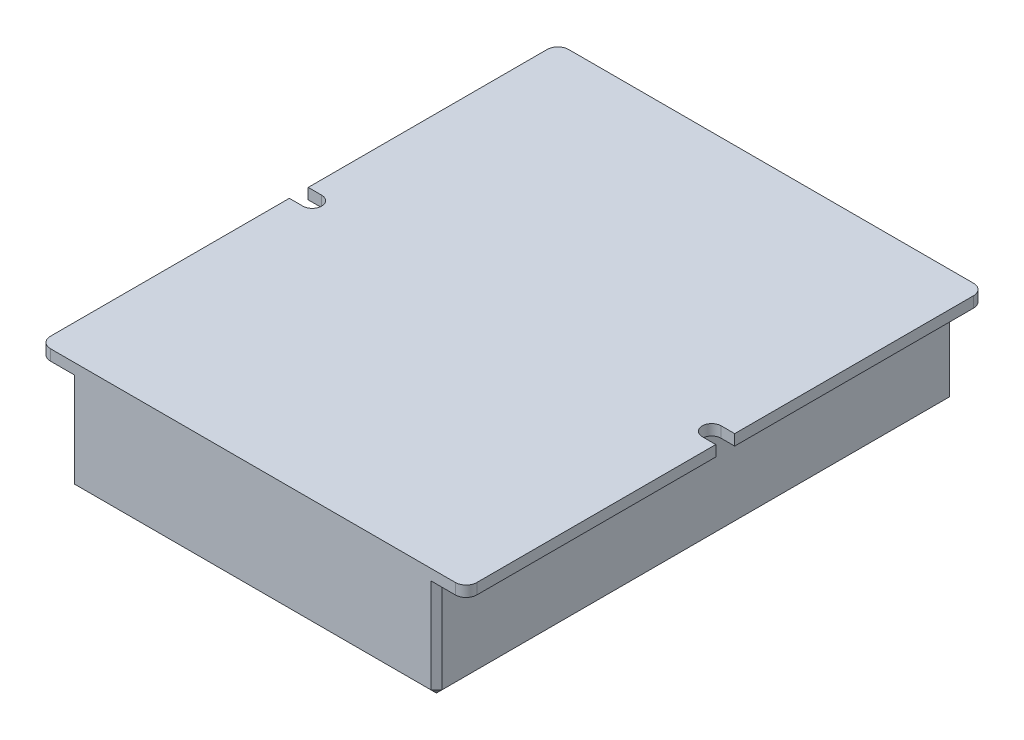
ISO-10303-21;
HEADER;
FILE_DESCRIPTION(('STEP AP214'),'2;1');
FILE_NAME('part.step','',(''),(''),'','','');
FILE_SCHEMA(('AUTOMOTIVE_DESIGN { 1 0 10303 214 1 1 1 1 }'));
ENDSEC;
DATA;
#1=APPLICATION_CONTEXT('core data for automotive mechanical design processes');
#2=APPLICATION_PROTOCOL_DEFINITION('international standard','automotive_design',2000,#1);
#3=PRODUCT_CONTEXT('',#1,'mechanical');
#4=PRODUCT('Part','Part','',(#3));
#5=PRODUCT_RELATED_PRODUCT_CATEGORY('part','',(#4));
#6=PRODUCT_DEFINITION_FORMATION('','',#4);
#7=PRODUCT_DEFINITION_CONTEXT('part definition',#1,'design');
#8=PRODUCT_DEFINITION('design','',#6,#7);
#9=PRODUCT_DEFINITION_SHAPE('','',#8);
#10=(LENGTH_UNIT() NAMED_UNIT(*) SI_UNIT(.MILLI.,.METRE.));
#11=(NAMED_UNIT(*) PLANE_ANGLE_UNIT() SI_UNIT($,.RADIAN.));
#12=(NAMED_UNIT(*) SI_UNIT($,.STERADIAN.) SOLID_ANGLE_UNIT());
#13=UNCERTAINTY_MEASURE_WITH_UNIT(LENGTH_MEASURE(1.E-05),#10,'distance_accuracy_value','');
#14=(GEOMETRIC_REPRESENTATION_CONTEXT(3) GLOBAL_UNCERTAINTY_ASSIGNED_CONTEXT((#13)) GLOBAL_UNIT_ASSIGNED_CONTEXT((#10,
#11,#12)) REPRESENTATION_CONTEXT('',''));
#15=CARTESIAN_POINT('',(0.,0.,0.));
#16=DIRECTION('',(0.,0.,1.));
#17=DIRECTION('',(1.,0.,0.));
#18=AXIS2_PLACEMENT_3D('',#15,#16,#17);
#19=CARTESIAN_POINT('',(-39.5,0.,48.));
#20=DIRECTION('',(-1.,0.,0.));
#21=DIRECTION('',(0.,0.,1.));
#22=AXIS2_PLACEMENT_3D('',#19,#20,#21);
#23=PLANE('',#22);
#24=DIRECTION('',(0.,0.,-1.));
#25=VECTOR('',#24,1.);
#26=CARTESIAN_POINT('',(-39.5,0.,48.));
#27=LINE('',#26,#25);
#28=CARTESIAN_POINT('',(-39.5,0.,46.));
#29=VERTEX_POINT('',#28);
#30=CARTESIAN_POINT('',(-39.5,0.,1.75));
#31=VERTEX_POINT('',#30);
#32=EDGE_CURVE('E237',#29,#31,#27,.T.);
#33=ORIENTED_EDGE('',*,*,#32,.T.);
#34=DIRECTION('',(0.,-1.,0.));
#35=VECTOR('',#34,1.);
#36=CARTESIAN_POINT('',(-39.5,10.3090938927864,1.75));
#37=LINE('',#36,#35);
#38=CARTESIAN_POINT('',(-39.5,-2.,1.75));
#39=VERTEX_POINT('',#38);
#40=EDGE_CURVE('E33',#31,#39,#37,.T.);
#41=ORIENTED_EDGE('',*,*,#40,.T.);
#42=DIRECTION('',(0.,0.,-1.));
#43=VECTOR('',#42,1.);
#44=CARTESIAN_POINT('',(-39.5,-2.,48.));
#45=LINE('',#44,#43);
#46=CARTESIAN_POINT('',(-39.5,-2.,46.));
#47=VERTEX_POINT('',#46);
#48=EDGE_CURVE('E207',#47,#39,#45,.T.);
#49=ORIENTED_EDGE('',*,*,#48,.F.);
#50=DIRECTION('',(0.,-1.,0.));
#51=VECTOR('',#50,1.);
#52=CARTESIAN_POINT('',(-39.5,0.,46.));
#53=LINE('',#52,#51);
#54=EDGE_CURVE('E345',#47,#29,#53,.F.);
#55=ORIENTED_EDGE('',*,*,#54,.T.);
#56=EDGE_LOOP('',(#33,#41,#49,#55));
#57=FACE_BOUND('',#56,.T.);
#58=ADVANCED_FACE('F18',(#57),#23,.T.);
#59=CARTESIAN_POINT('',(-37.,6.52027712167723,0.));
#60=DIRECTION('',(0.,-1.,0.));
#61=DIRECTION('',(0.,0.,-1.));
#62=AXIS2_PLACEMENT_3D('',#59,#60,#61);
#63=CYLINDRICAL_SURFACE('',#62,1.75);
#64=CARTESIAN_POINT('',(-37.,0.,0.));
#65=DIRECTION('',(0.,1.,0.));
#66=DIRECTION('',(0.,0.,1.));
#67=AXIS2_PLACEMENT_3D('',#64,#65,#66);
#68=CIRCLE('',#67,1.75);
#69=CARTESIAN_POINT('',(-37.,0.,-1.75));
#70=VERTEX_POINT('',#69);
#71=CARTESIAN_POINT('',(-37.,0.,1.75));
#72=VERTEX_POINT('',#71);
#73=EDGE_CURVE('E213',#70,#72,#68,.F.);
#74=ORIENTED_EDGE('',*,*,#73,.F.);
#75=DIRECTION('',(0.,-1.,0.));
#76=VECTOR('',#75,1.);
#77=CARTESIAN_POINT('',(-37.,10.3090938927864,-1.75));
#78=LINE('',#77,#76);
#79=CARTESIAN_POINT('',(-37.,-2.,-1.75));
#80=VERTEX_POINT('',#79);
#81=EDGE_CURVE('E41',#70,#80,#78,.T.);
#82=ORIENTED_EDGE('',*,*,#81,.T.);
#83=CARTESIAN_POINT('',(-37.,-2.,0.));
#84=DIRECTION('',(0.,1.,0.));
#85=DIRECTION('',(1.,0.,0.));
#86=AXIS2_PLACEMENT_3D('',#83,#84,#85);
#87=CIRCLE('',#86,1.75);
#88=CARTESIAN_POINT('',(-37.,-2.,1.75));
#89=VERTEX_POINT('',#88);
#90=EDGE_CURVE('E205',#89,#80,#87,.T.);
#91=ORIENTED_EDGE('',*,*,#90,.F.);
#92=DIRECTION('',(0.,-1.,0.));
#93=VECTOR('',#92,1.);
#94=CARTESIAN_POINT('',(-37.,10.3090938927864,1.75));
#95=LINE('',#94,#93);
#96=EDGE_CURVE('E189',#72,#89,#95,.T.);
#97=ORIENTED_EDGE('',*,*,#96,.F.);
#98=EDGE_LOOP('',(#74,#82,#91,#97));
#99=FACE_BOUND('',#98,.T.);
#100=ADVANCED_FACE('F211',(#99),#63,.F.);
#101=CARTESIAN_POINT('',(39.5,0.,-48.));
#102=DIRECTION('',(1.,0.,0.));
#103=DIRECTION('',(0.,0.,-1.));
#104=AXIS2_PLACEMENT_3D('',#101,#102,#103);
#105=PLANE('',#104);
#106=DIRECTION('',(0.,0.,1.));
#107=VECTOR('',#106,1.);
#108=CARTESIAN_POINT('',(39.5,0.,-48.));
#109=LINE('',#108,#107);
#110=CARTESIAN_POINT('',(39.5,0.,-46.));
#111=VERTEX_POINT('',#110);
#112=CARTESIAN_POINT('',(39.5,0.,-1.75));
#113=VERTEX_POINT('',#112);
#114=EDGE_CURVE('E228',#111,#113,#109,.T.);
#115=ORIENTED_EDGE('',*,*,#114,.T.);
#116=DIRECTION('',(0.,-1.,0.));
#117=VECTOR('',#116,1.);
#118=CARTESIAN_POINT('',(39.5,10.885688738745,-1.75));
#119=LINE('',#118,#117);
#120=CARTESIAN_POINT('',(39.5,-2.,-1.75));
#121=VERTEX_POINT('',#120);
#122=EDGE_CURVE('E409',#113,#121,#119,.T.);
#123=ORIENTED_EDGE('',*,*,#122,.T.);
#124=DIRECTION('',(0.,0.,1.));
#125=VECTOR('',#124,1.);
#126=CARTESIAN_POINT('',(39.5,-2.,-48.));
#127=LINE('',#126,#125);
#128=CARTESIAN_POINT('',(39.5,-2.,-46.));
#129=VERTEX_POINT('',#128);
#130=EDGE_CURVE('E233',#129,#121,#127,.T.);
#131=ORIENTED_EDGE('',*,*,#130,.F.);
#132=DIRECTION('',(0.,-1.,0.));
#133=VECTOR('',#132,1.);
#134=CARTESIAN_POINT('',(39.5,0.,-46.));
#135=LINE('',#134,#133);
#136=EDGE_CURVE('E365',#129,#111,#135,.F.);
#137=ORIENTED_EDGE('',*,*,#136,.T.);
#138=EDGE_LOOP('',(#115,#123,#131,#137));
#139=FACE_BOUND('',#138,.T.);
#140=ADVANCED_FACE('F463',(#139),#105,.T.);
#141=CARTESIAN_POINT('',(37.,6.52027712167723,0.));
#142=DIRECTION('',(0.,-1.,0.));
#143=DIRECTION('',(0.,0.,-1.));
#144=AXIS2_PLACEMENT_3D('',#141,#142,#143);
#145=CYLINDRICAL_SURFACE('',#144,1.75);
#146=CARTESIAN_POINT('',(37.,0.,0.));
#147=DIRECTION('',(0.,1.,0.));
#148=DIRECTION('',(0.,0.,1.));
#149=AXIS2_PLACEMENT_3D('',#146,#147,#148);
#150=CIRCLE('',#149,1.75);
#151=CARTESIAN_POINT('',(37.,0.,1.75));
#152=VERTEX_POINT('',#151);
#153=CARTESIAN_POINT('',(37.,0.,-1.75));
#154=VERTEX_POINT('',#153);
#155=EDGE_CURVE('E214',#152,#154,#150,.F.);
#156=ORIENTED_EDGE('',*,*,#155,.F.);
#157=DIRECTION('',(0.,-1.,0.));
#158=VECTOR('',#157,1.);
#159=CARTESIAN_POINT('',(37.,10.885688738745,1.75));
#160=LINE('',#159,#158);
#161=CARTESIAN_POINT('',(37.,-2.,1.75));
#162=VERTEX_POINT('',#161);
#163=EDGE_CURVE('E405',#152,#162,#160,.T.);
#164=ORIENTED_EDGE('',*,*,#163,.T.);
#165=CARTESIAN_POINT('',(37.,-2.,0.));
#166=DIRECTION('',(0.,1.,0.));
#167=DIRECTION('',(1.,0.,0.));
#168=AXIS2_PLACEMENT_3D('',#165,#166,#167);
#169=CIRCLE('',#168,1.75);
#170=CARTESIAN_POINT('',(37.,-2.,-1.75));
#171=VERTEX_POINT('',#170);
#172=EDGE_CURVE('E223',#171,#162,#169,.T.);
#173=ORIENTED_EDGE('',*,*,#172,.F.);
#174=DIRECTION('',(0.,-1.,0.));
#175=VECTOR('',#174,1.);
#176=CARTESIAN_POINT('',(37.,10.885688738745,-1.75));
#177=LINE('',#176,#175);
#178=EDGE_CURVE('E398',#154,#171,#177,.T.);
#179=ORIENTED_EDGE('',*,*,#178,.F.);
#180=EDGE_LOOP('',(#156,#164,#173,#179));
#181=FACE_BOUND('',#180,.T.);
#182=ADVANCED_FACE('F403',(#181),#145,.F.);
#183=CARTESIAN_POINT('',(0.,-2.,0.));
#184=DIRECTION('',(0.,1.,0.));
#185=DIRECTION('',(0.,0.,1.));
#186=AXIS2_PLACEMENT_3D('',#183,#184,#185);
#187=PLANE('',#186);
#188=DIRECTION('',(1.,0.,0.));
#189=VECTOR('',#188,1.);
#190=CARTESIAN_POINT('',(37.,-2.,-1.75));
#191=LINE('',#190,#189);
#192=EDGE_CURVE('E433',#171,#121,#191,.T.);
#193=ORIENTED_EDGE('',*,*,#192,.F.);
#194=ORIENTED_EDGE('',*,*,#172,.T.);
#195=DIRECTION('',(-1.,0.,0.));
#196=VECTOR('',#195,1.);
#197=CARTESIAN_POINT('',(37.,-2.,1.75));
#198=LINE('',#197,#196);
#199=CARTESIAN_POINT('',(39.5,-2.,1.75));
#200=VERTEX_POINT('',#199);
#201=EDGE_CURVE('E432',#200,#162,#198,.T.);
#202=ORIENTED_EDGE('',*,*,#201,.F.);
#203=CARTESIAN_POINT('',(39.5,-2.,46.));
#204=VERTEX_POINT('',#203);
#205=EDGE_CURVE('E220',#200,#204,#127,.T.);
#206=ORIENTED_EDGE('',*,*,#205,.T.);
#207=CARTESIAN_POINT('',(37.5,-2.,46.));
#208=DIRECTION('',(0.,1.,0.));
#209=DIRECTION('',(0.,0.,1.));
#210=AXIS2_PLACEMENT_3D('',#207,#208,#209);
#211=CIRCLE('',#210,2.);
#212=CARTESIAN_POINT('',(37.5,-2.,48.));
#213=VERTEX_POINT('',#212);
#214=EDGE_CURVE('E372',#204,#213,#211,.F.);
#215=ORIENTED_EDGE('',*,*,#214,.T.);
#216=DIRECTION('',(1.,0.,0.));
#217=VECTOR('',#216,1.);
#218=CARTESIAN_POINT('',(-37.,-2.,48.));
#219=LINE('',#218,#217);
#220=CARTESIAN_POINT('',(33.,-2.,48.));
#221=VERTEX_POINT('',#220);
#222=EDGE_CURVE('E252',#221,#213,#219,.T.);
#223=ORIENTED_EDGE('',*,*,#222,.F.);
#224=DIRECTION('',(0.707106781186545,0.,-0.70710678118655));
#225=VECTOR('',#224,1.);
#226=CARTESIAN_POINT('',(40.5,-2.,40.5));
#227=LINE('',#226,#225);
#228=CARTESIAN_POINT('',(34.,-2.,47.));
#229=VERTEX_POINT('',#228);
#230=EDGE_CURVE('E297',#221,#229,#227,.T.);
#231=ORIENTED_EDGE('',*,*,#230,.T.);
#232=DIRECTION('',(0.,0.,1.));
#233=VECTOR('',#232,1.);
#234=CARTESIAN_POINT('',(34.,-2.,0.));
#235=LINE('',#234,#233);
#236=CARTESIAN_POINT('',(34.,-2.,-47.));
#237=VERTEX_POINT('',#236);
#238=EDGE_CURVE('E340',#237,#229,#235,.T.);
#239=ORIENTED_EDGE('',*,*,#238,.F.);
#240=DIRECTION('',(-0.707106781186548,0.,-0.707106781186548));
#241=VECTOR('',#240,1.);
#242=CARTESIAN_POINT('',(40.5,-2.,-40.5));
#243=LINE('',#242,#241);
#244=CARTESIAN_POINT('',(33.,-2.,-48.));
#245=VERTEX_POINT('',#244);
#246=EDGE_CURVE('E299',#237,#245,#243,.T.);
#247=ORIENTED_EDGE('',*,*,#246,.T.);
#248=DIRECTION('',(-1.,0.,0.));
#249=VECTOR('',#248,1.);
#250=CARTESIAN_POINT('',(37.,-2.,-48.));
#251=LINE('',#250,#249);
#252=CARTESIAN_POINT('',(37.5,-2.,-48.));
#253=VERTEX_POINT('',#252);
#254=EDGE_CURVE('E244',#253,#245,#251,.T.);
#255=ORIENTED_EDGE('',*,*,#254,.F.);
#256=CARTESIAN_POINT('',(37.5,-2.,-46.));
#257=DIRECTION('',(0.,1.,0.));
#258=DIRECTION('',(0.,0.,1.));
#259=AXIS2_PLACEMENT_3D('',#256,#257,#258);
#260=CIRCLE('',#259,2.);
#261=EDGE_CURVE('E363',#253,#129,#260,.F.);
#262=ORIENTED_EDGE('',*,*,#261,.T.);
#263=ORIENTED_EDGE('',*,*,#130,.T.);
#264=EDGE_LOOP('',(#193,#194,#202,#206,#215,#223,#231,#239,#247,#255,#262,#263));
#265=FACE_BOUND('',#264,.T.);
#266=ADVANCED_FACE('F431',(#265),#187,.F.);
#267=DIRECTION('',(-1.,0.,0.));
#268=VECTOR('',#267,1.);
#269=CARTESIAN_POINT('',(-37.,-2.,1.75));
#270=LINE('',#269,#268);
#271=EDGE_CURVE('E192',#89,#39,#270,.T.);
#272=ORIENTED_EDGE('',*,*,#271,.F.);
#273=ORIENTED_EDGE('',*,*,#90,.T.);
#274=DIRECTION('',(1.,0.,0.));
#275=VECTOR('',#274,1.);
#276=CARTESIAN_POINT('',(-37.,-2.,-1.75));
#277=LINE('',#276,#275);
#278=CARTESIAN_POINT('',(-39.5,-2.,-1.75));
#279=VERTEX_POINT('',#278);
#280=EDGE_CURVE('E209',#279,#80,#277,.T.);
#281=ORIENTED_EDGE('',*,*,#280,.F.);
#282=CARTESIAN_POINT('',(-39.5,-2.,-46.));
#283=VERTEX_POINT('',#282);
#284=EDGE_CURVE('E231',#279,#283,#45,.T.);
#285=ORIENTED_EDGE('',*,*,#284,.T.);
#286=CARTESIAN_POINT('',(-37.5,-2.,-46.));
#287=DIRECTION('',(0.,1.,0.));
#288=DIRECTION('',(0.,0.,1.));
#289=AXIS2_PLACEMENT_3D('',#286,#287,#288);
#290=CIRCLE('',#289,2.);
#291=CARTESIAN_POINT('',(-37.5,-2.,-48.));
#292=VERTEX_POINT('',#291);
#293=EDGE_CURVE('E352',#283,#292,#290,.F.);
#294=ORIENTED_EDGE('',*,*,#293,.T.);
#295=CARTESIAN_POINT('',(-33.,-2.,-48.));
#296=VERTEX_POINT('',#295);
#297=EDGE_CURVE('E248',#296,#292,#251,.T.);
#298=ORIENTED_EDGE('',*,*,#297,.F.);
#299=DIRECTION('',(-0.707106781186545,0.,0.70710678118655));
#300=VECTOR('',#299,1.);
#301=CARTESIAN_POINT('',(-40.5,-2.,-40.5));
#302=LINE('',#301,#300);
#303=CARTESIAN_POINT('',(-34.,-2.,-47.));
#304=VERTEX_POINT('',#303);
#305=EDGE_CURVE('E302',#296,#304,#302,.T.);
#306=ORIENTED_EDGE('',*,*,#305,.T.);
#307=DIRECTION('',(0.,0.,-1.));
#308=VECTOR('',#307,1.);
#309=CARTESIAN_POINT('',(-34.,-2.,0.));
#310=LINE('',#309,#308);
#311=CARTESIAN_POINT('',(-34.,-2.,47.));
#312=VERTEX_POINT('',#311);
#313=EDGE_CURVE('E418',#312,#304,#310,.T.);
#314=ORIENTED_EDGE('',*,*,#313,.F.);
#315=DIRECTION('',(0.707106781186548,0.,0.707106781186548));
#316=VECTOR('',#315,1.);
#317=CARTESIAN_POINT('',(-40.5,-2.,40.5));
#318=LINE('',#317,#316);
#319=CARTESIAN_POINT('',(-33.,-2.,48.));
#320=VERTEX_POINT('',#319);
#321=EDGE_CURVE('E294',#312,#320,#318,.T.);
#322=ORIENTED_EDGE('',*,*,#321,.T.);
#323=CARTESIAN_POINT('',(-37.5,-2.,48.));
#324=VERTEX_POINT('',#323);
#325=EDGE_CURVE('E249',#324,#320,#219,.T.);
#326=ORIENTED_EDGE('',*,*,#325,.F.);
#327=CARTESIAN_POINT('',(-37.5,-2.,46.));
#328=DIRECTION('',(0.,1.,0.));
#329=DIRECTION('',(0.,0.,1.));
#330=AXIS2_PLACEMENT_3D('',#327,#328,#329);
#331=CIRCLE('',#330,2.);
#332=EDGE_CURVE('E343',#324,#47,#331,.F.);
#333=ORIENTED_EDGE('',*,*,#332,.T.);
#334=ORIENTED_EDGE('',*,*,#48,.T.);
#335=EDGE_LOOP('',(#272,#273,#281,#285,#294,#298,#306,#314,#322,#326,#333,#334));
#336=FACE_BOUND('',#335,.T.);
#337=ADVANCED_FACE('F203',(#336),#187,.F.);
#338=CARTESIAN_POINT('',(-37.,-2.,48.));
#339=DIRECTION('',(0.,0.,1.));
#340=DIRECTION('',(1.,0.,0.));
#341=AXIS2_PLACEMENT_3D('',#338,#339,#340);
#342=PLANE('',#341);
#343=ORIENTED_EDGE('',*,*,#222,.T.);
#344=DIRECTION('',(0.,-1.,0.));
#345=VECTOR('',#344,1.);
#346=CARTESIAN_POINT('',(37.5,-2.,48.));
#347=LINE('',#346,#345);
#348=CARTESIAN_POINT('',(37.5,0.,48.));
#349=VERTEX_POINT('',#348);
#350=EDGE_CURVE('E26',#213,#349,#347,.F.);
#351=ORIENTED_EDGE('',*,*,#350,.T.);
#352=DIRECTION('',(1.,0.,0.));
#353=VECTOR('',#352,1.);
#354=CARTESIAN_POINT('',(-37.,0.,48.));
#355=LINE('',#354,#353);
#356=CARTESIAN_POINT('',(-37.5,0.,48.));
#357=VERTEX_POINT('',#356);
#358=EDGE_CURVE('E240',#357,#349,#355,.T.);
#359=ORIENTED_EDGE('',*,*,#358,.F.);
#360=DIRECTION('',(0.,-1.,0.));
#361=VECTOR('',#360,1.);
#362=CARTESIAN_POINT('',(-37.5,-2.,48.));
#363=LINE('',#362,#361);
#364=EDGE_CURVE('E304',#357,#324,#363,.T.);
#365=ORIENTED_EDGE('',*,*,#364,.T.);
#366=ORIENTED_EDGE('',*,*,#325,.T.);
#367=DIRECTION('',(0.,-1.,0.));
#368=VECTOR('',#367,1.);
#369=CARTESIAN_POINT('',(-33.,-20.5,48.));
#370=LINE('',#369,#368);
#371=CARTESIAN_POINT('',(-33.,-19.5,48.));
#372=VERTEX_POINT('',#371);
#373=EDGE_CURVE('E279',#320,#372,#370,.T.);
#374=ORIENTED_EDGE('',*,*,#373,.T.);
#375=DIRECTION('',(1.,0.,0.));
#376=VECTOR('',#375,1.);
#377=CARTESIAN_POINT('',(-37.,-19.5,48.));
#378=LINE('',#377,#376);
#379=CARTESIAN_POINT('',(33.,-19.5,48.));
#380=VERTEX_POINT('',#379);
#381=EDGE_CURVE('E274',#372,#380,#378,.T.);
#382=ORIENTED_EDGE('',*,*,#381,.T.);
#383=DIRECTION('',(0.,1.,0.));
#384=VECTOR('',#383,1.);
#385=CARTESIAN_POINT('',(33.,-2.,48.));
#386=LINE('',#385,#384);
#387=EDGE_CURVE('E276',#380,#221,#386,.T.);
#388=ORIENTED_EDGE('',*,*,#387,.T.);
#389=EDGE_LOOP('',(#343,#351,#359,#365,#366,#374,#382,#388));
#390=FACE_BOUND('',#389,.T.);
#391=ADVANCED_FACE('F377',(#390),#342,.T.);
#392=CARTESIAN_POINT('',(37.,-2.,-48.));
#393=DIRECTION('',(0.,0.,-1.));
#394=DIRECTION('',(-1.,0.,0.));
#395=AXIS2_PLACEMENT_3D('',#392,#393,#394);
#396=PLANE('',#395);
#397=DIRECTION('',(-1.,0.,0.));
#398=VECTOR('',#397,1.);
#399=CARTESIAN_POINT('',(37.,0.,-48.));
#400=LINE('',#399,#398);
#401=CARTESIAN_POINT('',(37.5,0.,-48.));
#402=VERTEX_POINT('',#401);
#403=CARTESIAN_POINT('',(-37.5,0.,-48.));
#404=VERTEX_POINT('',#403);
#405=EDGE_CURVE('E253',#402,#404,#400,.T.);
#406=ORIENTED_EDGE('',*,*,#405,.F.);
#407=DIRECTION('',(0.,-1.,0.));
#408=VECTOR('',#407,1.);
#409=CARTESIAN_POINT('',(37.5,-2.,-48.));
#410=LINE('',#409,#408);
#411=EDGE_CURVE('E360',#402,#253,#410,.T.);
#412=ORIENTED_EDGE('',*,*,#411,.T.);
#413=ORIENTED_EDGE('',*,*,#254,.T.);
#414=DIRECTION('',(0.,-1.,0.));
#415=VECTOR('',#414,1.);
#416=CARTESIAN_POINT('',(33.,-20.5,-48.));
#417=LINE('',#416,#415);
#418=CARTESIAN_POINT('',(33.,-19.5,-48.));
#419=VERTEX_POINT('',#418);
#420=EDGE_CURVE('E292',#245,#419,#417,.T.);
#421=ORIENTED_EDGE('',*,*,#420,.T.);
#422=DIRECTION('',(-1.,0.,0.));
#423=VECTOR('',#422,1.);
#424=CARTESIAN_POINT('',(37.,-19.5,-48.));
#425=LINE('',#424,#423);
#426=CARTESIAN_POINT('',(-33.,-19.5,-48.));
#427=VERTEX_POINT('',#426);
#428=EDGE_CURVE('E290',#419,#427,#425,.T.);
#429=ORIENTED_EDGE('',*,*,#428,.T.);
#430=DIRECTION('',(0.,1.,0.));
#431=VECTOR('',#430,1.);
#432=CARTESIAN_POINT('',(-33.,-2.,-48.));
#433=LINE('',#432,#431);
#434=EDGE_CURVE('E287',#427,#296,#433,.T.);
#435=ORIENTED_EDGE('',*,*,#434,.T.);
#436=ORIENTED_EDGE('',*,*,#297,.T.);
#437=DIRECTION('',(0.,-1.,0.));
#438=VECTOR('',#437,1.);
#439=CARTESIAN_POINT('',(-37.5,-2.,-48.));
#440=LINE('',#439,#438);
#441=EDGE_CURVE('E354',#292,#404,#440,.F.);
#442=ORIENTED_EDGE('',*,*,#441,.T.);
#443=EDGE_LOOP('',(#406,#412,#413,#421,#429,#435,#436,#442));
#444=FACE_BOUND('',#443,.T.);
#445=ADVANCED_FACE('F474',(#444),#396,.T.);
#446=CARTESIAN_POINT('',(0.,0.,0.));
#447=DIRECTION('',(0.,1.,0.));
#448=DIRECTION('',(0.,0.,1.));
#449=AXIS2_PLACEMENT_3D('',#446,#447,#448);
#450=PLANE('',#449);
#451=DIRECTION('',(1.,0.,0.));
#452=VECTOR('',#451,1.);
#453=CARTESIAN_POINT('',(0.,0.,1.75));
#454=LINE('',#453,#452);
#455=EDGE_CURVE('E193',#31,#72,#454,.T.);
#456=ORIENTED_EDGE('',*,*,#455,.F.);
#457=ORIENTED_EDGE('',*,*,#32,.F.);
#458=CARTESIAN_POINT('',(-37.5,0.,46.));
#459=DIRECTION('',(0.,1.,0.));
#460=DIRECTION('',(0.,0.,1.));
#461=AXIS2_PLACEMENT_3D('',#458,#459,#460);
#462=CIRCLE('',#461,2.);
#463=EDGE_CURVE('E347',#29,#357,#462,.T.);
#464=ORIENTED_EDGE('',*,*,#463,.T.);
#465=ORIENTED_EDGE('',*,*,#358,.T.);
#466=CARTESIAN_POINT('',(37.5,0.,46.));
#467=DIRECTION('',(0.,1.,0.));
#468=DIRECTION('',(0.,0.,1.));
#469=AXIS2_PLACEMENT_3D('',#466,#467,#468);
#470=CIRCLE('',#469,2.);
#471=CARTESIAN_POINT('',(39.5,0.,46.));
#472=VERTEX_POINT('',#471);
#473=EDGE_CURVE('E11',#349,#472,#470,.T.);
#474=ORIENTED_EDGE('',*,*,#473,.T.);
#475=CARTESIAN_POINT('',(39.5,0.,1.75));
#476=VERTEX_POINT('',#475);
#477=EDGE_CURVE('E232',#476,#472,#109,.T.);
#478=ORIENTED_EDGE('',*,*,#477,.F.);
#479=DIRECTION('',(1.,0.,0.));
#480=VECTOR('',#479,1.);
#481=CARTESIAN_POINT('',(0.,0.,1.75));
#482=LINE('',#481,#480);
#483=EDGE_CURVE('E394',#152,#476,#482,.T.);
#484=ORIENTED_EDGE('',*,*,#483,.F.);
#485=ORIENTED_EDGE('',*,*,#155,.T.);
#486=DIRECTION('',(-1.,0.,0.));
#487=VECTOR('',#486,1.);
#488=CARTESIAN_POINT('',(0.,0.,-1.75));
#489=LINE('',#488,#487);
#490=EDGE_CURVE('E308',#113,#154,#489,.T.);
#491=ORIENTED_EDGE('',*,*,#490,.F.);
#492=ORIENTED_EDGE('',*,*,#114,.F.);
#493=CARTESIAN_POINT('',(37.5,0.,-46.));
#494=DIRECTION('',(0.,1.,0.));
#495=DIRECTION('',(0.,0.,1.));
#496=AXIS2_PLACEMENT_3D('',#493,#494,#495);
#497=CIRCLE('',#496,2.);
#498=EDGE_CURVE('E367',#111,#402,#497,.T.);
#499=ORIENTED_EDGE('',*,*,#498,.T.);
#500=ORIENTED_EDGE('',*,*,#405,.T.);
#501=CARTESIAN_POINT('',(-37.5,0.,-46.));
#502=DIRECTION('',(0.,1.,0.));
#503=DIRECTION('',(0.,0.,1.));
#504=AXIS2_PLACEMENT_3D('',#501,#502,#503);
#505=CIRCLE('',#504,2.);
#506=CARTESIAN_POINT('',(-39.5,0.,-46.));
#507=VERTEX_POINT('',#506);
#508=EDGE_CURVE('E357',#404,#507,#505,.T.);
#509=ORIENTED_EDGE('',*,*,#508,.T.);
#510=CARTESIAN_POINT('',(-39.5,0.,-1.75));
#511=VERTEX_POINT('',#510);
#512=EDGE_CURVE('E241',#511,#507,#27,.T.);
#513=ORIENTED_EDGE('',*,*,#512,.F.);
#514=DIRECTION('',(-1.,0.,0.));
#515=VECTOR('',#514,1.);
#516=CARTESIAN_POINT('',(0.,0.,-1.75));
#517=LINE('',#516,#515);
#518=EDGE_CURVE('E198',#70,#511,#517,.T.);
#519=ORIENTED_EDGE('',*,*,#518,.F.);
#520=ORIENTED_EDGE('',*,*,#73,.T.);
#521=EDGE_LOOP('',(#456,#457,#464,#465,#474,#478,#484,#485,#491,#492,#499,#500,#509,#513,#519,#520));
#522=FACE_BOUND('',#521,.T.);
#523=ADVANCED_FACE('F383',(#522),#450,.T.);
#524=DIRECTION('',(0.,-1.,0.));
#525=VECTOR('',#524,1.);
#526=CARTESIAN_POINT('',(-39.5,10.3090938927864,-1.75));
#527=LINE('',#526,#525);
#528=EDGE_CURVE('E478',#511,#279,#527,.T.);
#529=ORIENTED_EDGE('',*,*,#528,.F.);
#530=ORIENTED_EDGE('',*,*,#512,.T.);
#531=DIRECTION('',(0.,-1.,0.));
#532=VECTOR('',#531,1.);
#533=CARTESIAN_POINT('',(-39.5,0.,-46.));
#534=LINE('',#533,#532);
#535=EDGE_CURVE('E349',#507,#283,#534,.T.);
#536=ORIENTED_EDGE('',*,*,#535,.T.);
#537=ORIENTED_EDGE('',*,*,#284,.F.);
#538=EDGE_LOOP('',(#529,#530,#536,#537));
#539=FACE_BOUND('',#538,.T.);
#540=ADVANCED_FACE('F459',(#539),#23,.T.);
#541=DIRECTION('',(0.,-1.,0.));
#542=VECTOR('',#541,1.);
#543=CARTESIAN_POINT('',(39.5,10.885688738745,1.75));
#544=LINE('',#543,#542);
#545=EDGE_CURVE('E392',#476,#200,#544,.T.);
#546=ORIENTED_EDGE('',*,*,#545,.F.);
#547=ORIENTED_EDGE('',*,*,#477,.T.);
#548=DIRECTION('',(0.,-1.,0.));
#549=VECTOR('',#548,1.);
#550=CARTESIAN_POINT('',(39.5,0.,46.));
#551=LINE('',#550,#549);
#552=EDGE_CURVE('E369',#472,#204,#551,.T.);
#553=ORIENTED_EDGE('',*,*,#552,.T.);
#554=ORIENTED_EDGE('',*,*,#205,.F.);
#555=EDGE_LOOP('',(#546,#547,#553,#554));
#556=FACE_BOUND('',#555,.T.);
#557=ADVANCED_FACE('F391',(#556),#105,.T.);
#558=CARTESIAN_POINT('',(34.,-20.5,0.));
#559=DIRECTION('',(-1.,0.,0.));
#560=DIRECTION('',(0.,0.,1.));
#561=AXIS2_PLACEMENT_3D('',#558,#559,#560);
#562=PLANE('',#561);
#563=ORIENTED_EDGE('',*,*,#238,.T.);
#564=DIRECTION('',(0.,-1.,0.));
#565=VECTOR('',#564,1.);
#566=CARTESIAN_POINT('',(34.,-20.5,47.));
#567=LINE('',#566,#565);
#568=CARTESIAN_POINT('',(34.,-19.5,47.));
#569=VERTEX_POINT('',#568);
#570=EDGE_CURVE('E285',#229,#569,#567,.T.);
#571=ORIENTED_EDGE('',*,*,#570,.T.);
#572=DIRECTION('',(0.,0.,-1.));
#573=VECTOR('',#572,1.);
#574=CARTESIAN_POINT('',(34.,-19.5,-48.));
#575=LINE('',#574,#573);
#576=CARTESIAN_POINT('',(34.,-19.5,-47.));
#577=VERTEX_POINT('',#576);
#578=EDGE_CURVE('E281',#569,#577,#575,.T.);
#579=ORIENTED_EDGE('',*,*,#578,.T.);
#580=DIRECTION('',(0.,1.,0.));
#581=VECTOR('',#580,1.);
#582=CARTESIAN_POINT('',(34.,-2.,-47.));
#583=LINE('',#582,#581);
#584=EDGE_CURVE('E283',#577,#237,#583,.T.);
#585=ORIENTED_EDGE('',*,*,#584,.T.);
#586=EDGE_LOOP('',(#563,#571,#579,#585));
#587=FACE_BOUND('',#586,.T.);
#588=ADVANCED_FACE('F473',(#587),#562,.F.);
#589=CARTESIAN_POINT('',(-34.,-20.5,0.));
#590=DIRECTION('',(1.,0.,0.));
#591=DIRECTION('',(0.,0.,-1.));
#592=AXIS2_PLACEMENT_3D('',#589,#590,#591);
#593=PLANE('',#592);
#594=DIRECTION('',(0.,0.,1.));
#595=VECTOR('',#594,1.);
#596=CARTESIAN_POINT('',(-34.,-19.5,48.));
#597=LINE('',#596,#595);
#598=CARTESIAN_POINT('',(-34.,-19.5,-47.));
#599=VERTEX_POINT('',#598);
#600=CARTESIAN_POINT('',(-34.,-19.5,47.));
#601=VERTEX_POINT('',#600);
#602=EDGE_CURVE('E269',#599,#601,#597,.T.);
#603=ORIENTED_EDGE('',*,*,#602,.T.);
#604=DIRECTION('',(0.,1.,0.));
#605=VECTOR('',#604,1.);
#606=CARTESIAN_POINT('',(-34.,-2.,47.));
#607=LINE('',#606,#605);
#608=EDGE_CURVE('E272',#601,#312,#607,.T.);
#609=ORIENTED_EDGE('',*,*,#608,.T.);
#610=ORIENTED_EDGE('',*,*,#313,.T.);
#611=DIRECTION('',(0.,-1.,0.));
#612=VECTOR('',#611,1.);
#613=CARTESIAN_POINT('',(-34.,-20.5,-47.));
#614=LINE('',#613,#612);
#615=EDGE_CURVE('E267',#304,#599,#614,.T.);
#616=ORIENTED_EDGE('',*,*,#615,.T.);
#617=EDGE_LOOP('',(#603,#609,#610,#616));
#618=FACE_BOUND('',#617,.T.);
#619=ADVANCED_FACE('F550',(#618),#593,.F.);
#620=CARTESIAN_POINT('',(0.,-20.5,0.));
#621=DIRECTION('',(0.,-1.,0.));
#622=DIRECTION('',(0.,0.,-1.));
#623=AXIS2_PLACEMENT_3D('',#620,#621,#622);
#624=PLANE('',#623);
#625=DIRECTION('',(-1.,0.,0.));
#626=VECTOR('',#625,1.);
#627=CARTESIAN_POINT('',(0.,-20.5,47.));
#628=LINE('',#627,#626);
#629=CARTESIAN_POINT('',(33.,-20.5,47.));
#630=VERTEX_POINT('',#629);
#631=CARTESIAN_POINT('',(-33.,-20.5,47.));
#632=VERTEX_POINT('',#631);
#633=EDGE_CURVE('E247',#630,#632,#628,.T.);
#634=ORIENTED_EDGE('',*,*,#633,.T.);
#635=DIRECTION('',(0.,0.,-1.));
#636=VECTOR('',#635,1.);
#637=CARTESIAN_POINT('',(-33.,-20.5,-48.));
#638=LINE('',#637,#636);
#639=CARTESIAN_POINT('',(-33.,-20.5,-47.));
#640=VERTEX_POINT('',#639);
#641=EDGE_CURVE('E264',#632,#640,#638,.T.);
#642=ORIENTED_EDGE('',*,*,#641,.T.);
#643=DIRECTION('',(1.,0.,0.));
#644=VECTOR('',#643,1.);
#645=CARTESIAN_POINT('',(0.,-20.5,-47.));
#646=LINE('',#645,#644);
#647=CARTESIAN_POINT('',(33.,-20.5,-47.));
#648=VERTEX_POINT('',#647);
#649=EDGE_CURVE('E262',#640,#648,#646,.T.);
#650=ORIENTED_EDGE('',*,*,#649,.T.);
#651=DIRECTION('',(0.,0.,1.));
#652=VECTOR('',#651,1.);
#653=CARTESIAN_POINT('',(33.,-20.5,48.));
#654=LINE('',#653,#652);
#655=EDGE_CURVE('E260',#648,#630,#654,.T.);
#656=ORIENTED_EDGE('',*,*,#655,.T.);
#657=EDGE_LOOP('',(#634,#642,#650,#656));
#658=FACE_BOUND('',#657,.T.);
#659=ADVANCED_FACE('F552',(#658),#624,.T.);
#660=CARTESIAN_POINT('',(33.,-2.,48.));
#661=DIRECTION('',(0.70710678118655,0.,0.707106781186545));
#662=DIRECTION('',(0.,-1.,0.));
#663=AXIS2_PLACEMENT_3D('',#660,#661,#662);
#664=PLANE('',#663);
#665=ORIENTED_EDGE('',*,*,#230,.F.);
#666=ORIENTED_EDGE('',*,*,#387,.F.);
#667=DIRECTION('',(-0.707106781186545,0.,0.70710678118655));
#668=VECTOR('',#667,1.);
#669=CARTESIAN_POINT('',(34.,-19.5,47.));
#670=LINE('',#669,#668);
#671=EDGE_CURVE('E337',#569,#380,#670,.T.);
#672=ORIENTED_EDGE('',*,*,#671,.F.);
#673=ORIENTED_EDGE('',*,*,#570,.F.);
#674=EDGE_LOOP('',(#665,#666,#672,#673));
#675=FACE_BOUND('',#674,.T.);
#676=ADVANCED_FACE('F523',(#675),#664,.T.);
#677=CARTESIAN_POINT('',(33.,-20.5,0.));
#678=DIRECTION('',(0.707106781186548,-0.707106781186548,0.));
#679=DIRECTION('',(0.,0.,-1.));
#680=AXIS2_PLACEMENT_3D('',#677,#678,#679);
#681=PLANE('',#680);
#682=DIRECTION('',(-0.707106781186548,-0.707106781186548,0.));
#683=VECTOR('',#682,1.);
#684=CARTESIAN_POINT('',(33.5,-20.,-47.));
#685=LINE('',#684,#683);
#686=EDGE_CURVE('E331',#577,#648,#685,.T.);
#687=ORIENTED_EDGE('',*,*,#686,.F.);
#688=ORIENTED_EDGE('',*,*,#578,.F.);
#689=DIRECTION('',(0.707106781186548,0.707106781186548,0.));
#690=VECTOR('',#689,1.);
#691=CARTESIAN_POINT('',(34.,-19.5,47.));
#692=LINE('',#691,#690);
#693=EDGE_CURVE('E334',#630,#569,#692,.T.);
#694=ORIENTED_EDGE('',*,*,#693,.F.);
#695=ORIENTED_EDGE('',*,*,#655,.F.);
#696=EDGE_LOOP('',(#687,#688,#694,#695));
#697=FACE_BOUND('',#696,.T.);
#698=ADVANCED_FACE('F537',(#697),#681,.T.);
#699=CARTESIAN_POINT('',(34.,-20.5,-47.));
#700=DIRECTION('',(0.707106781186548,0.,-0.707106781186548));
#701=DIRECTION('',(0.,-1.,0.));
#702=AXIS2_PLACEMENT_3D('',#699,#700,#701);
#703=PLANE('',#702);
#704=ORIENTED_EDGE('',*,*,#246,.F.);
#705=ORIENTED_EDGE('',*,*,#584,.F.);
#706=DIRECTION('',(0.707106781186548,0.,0.707106781186548));
#707=VECTOR('',#706,1.);
#708=CARTESIAN_POINT('',(33.,-19.5,-48.));
#709=LINE('',#708,#707);
#710=EDGE_CURVE('E328',#419,#577,#709,.T.);
#711=ORIENTED_EDGE('',*,*,#710,.F.);
#712=ORIENTED_EDGE('',*,*,#420,.F.);
#713=EDGE_LOOP('',(#704,#705,#711,#712));
#714=FACE_BOUND('',#713,.T.);
#715=ADVANCED_FACE('F532',(#714),#703,.T.);
#716=CARTESIAN_POINT('',(34.,-19.5,47.));
#717=DIRECTION('',(0.577350269189627,-0.577350269189627,0.577350269189623));
#718=DIRECTION('',(0.707106781186548,0.707106781186548,0.));
#719=AXIS2_PLACEMENT_3D('',#716,#717,#718);
#720=PLANE('',#719);
#721=ORIENTED_EDGE('',*,*,#693,.T.);
#722=ORIENTED_EDGE('',*,*,#671,.T.);
#723=DIRECTION('',(0.,0.707106781186548,0.707106781186548));
#724=VECTOR('',#723,1.);
#725=CARTESIAN_POINT('',(33.,-20.,47.5));
#726=LINE('',#725,#724);
#727=EDGE_CURVE('E325',#630,#380,#726,.T.);
#728=ORIENTED_EDGE('',*,*,#727,.F.);
#729=EDGE_LOOP('',(#721,#722,#728));
#730=FACE_BOUND('',#729,.T.);
#731=ADVANCED_FACE('F517',(#730),#720,.T.);
#732=CARTESIAN_POINT('',(33.,-19.5,-48.));
#733=DIRECTION('',(0.577350269189626,-0.577350269189626,-0.577350269189626));
#734=DIRECTION('',(-0.707106781186548,0.,-0.707106781186548));
#735=AXIS2_PLACEMENT_3D('',#732,#733,#734);
#736=PLANE('',#735);
#737=ORIENTED_EDGE('',*,*,#710,.T.);
#738=ORIENTED_EDGE('',*,*,#686,.T.);
#739=DIRECTION('',(0.,-0.707106781186548,0.707106781186548));
#740=VECTOR('',#739,1.);
#741=CARTESIAN_POINT('',(33.,-19.5,-48.));
#742=LINE('',#741,#740);
#743=EDGE_CURVE('E322',#419,#648,#742,.T.);
#744=ORIENTED_EDGE('',*,*,#743,.F.);
#745=EDGE_LOOP('',(#737,#738,#744));
#746=FACE_BOUND('',#745,.T.);
#747=ADVANCED_FACE('F539',(#746),#736,.T.);
#748=CARTESIAN_POINT('',(-34.,-20.5,47.));
#749=DIRECTION('',(-0.707106781186548,0.,0.707106781186548));
#750=DIRECTION('',(0.,-1.,0.));
#751=AXIS2_PLACEMENT_3D('',#748,#749,#750);
#752=PLANE('',#751);
#753=ORIENTED_EDGE('',*,*,#321,.F.);
#754=ORIENTED_EDGE('',*,*,#608,.F.);
#755=DIRECTION('',(-0.707106781186548,0.,-0.707106781186548));
#756=VECTOR('',#755,1.);
#757=CARTESIAN_POINT('',(-34.,-19.5,47.));
#758=LINE('',#757,#756);
#759=EDGE_CURVE('E319',#372,#601,#758,.T.);
#760=ORIENTED_EDGE('',*,*,#759,.F.);
#761=ORIENTED_EDGE('',*,*,#373,.F.);
#762=EDGE_LOOP('',(#753,#754,#760,#761));
#763=FACE_BOUND('',#762,.T.);
#764=ADVANCED_FACE('F506',(#763),#752,.T.);
#765=CARTESIAN_POINT('',(0.,-20.5,47.));
#766=DIRECTION('',(0.,0.707106781186548,-0.707106781186548));
#767=DIRECTION('',(-1.,0.,0.));
#768=AXIS2_PLACEMENT_3D('',#765,#766,#767);
#769=PLANE('',#768);
#770=ORIENTED_EDGE('',*,*,#727,.T.);
#771=ORIENTED_EDGE('',*,*,#381,.F.);
#772=DIRECTION('',(0.,-0.707106781186548,-0.707106781186548));
#773=VECTOR('',#772,1.);
#774=CARTESIAN_POINT('',(-33.,-20.,47.5));
#775=LINE('',#774,#773);
#776=EDGE_CURVE('E316',#632,#372,#775,.F.);
#777=ORIENTED_EDGE('',*,*,#776,.F.);
#778=ORIENTED_EDGE('',*,*,#633,.F.);
#779=EDGE_LOOP('',(#770,#771,#777,#778));
#780=FACE_BOUND('',#779,.T.);
#781=ADVANCED_FACE('F512',(#780),#769,.F.);
#782=CARTESIAN_POINT('',(0.,-20.5,-47.));
#783=DIRECTION('',(0.,0.707106781186548,0.707106781186548));
#784=DIRECTION('',(1.,0.,0.));
#785=AXIS2_PLACEMENT_3D('',#782,#783,#784);
#786=PLANE('',#785);
#787=ORIENTED_EDGE('',*,*,#743,.T.);
#788=ORIENTED_EDGE('',*,*,#649,.F.);
#789=DIRECTION('',(0.,0.707106781186548,-0.707106781186548));
#790=VECTOR('',#789,1.);
#791=CARTESIAN_POINT('',(-33.,-20.5,-47.));
#792=LINE('',#791,#790);
#793=EDGE_CURVE('E313',#427,#640,#792,.F.);
#794=ORIENTED_EDGE('',*,*,#793,.F.);
#795=ORIENTED_EDGE('',*,*,#428,.F.);
#796=EDGE_LOOP('',(#787,#788,#794,#795));
#797=FACE_BOUND('',#796,.T.);
#798=ADVANCED_FACE('F542',(#797),#786,.F.);
#799=CARTESIAN_POINT('',(-33.,-2.,-48.));
#800=DIRECTION('',(-0.70710678118655,0.,-0.707106781186545));
#801=DIRECTION('',(0.,-1.,0.));
#802=AXIS2_PLACEMENT_3D('',#799,#800,#801);
#803=PLANE('',#802);
#804=ORIENTED_EDGE('',*,*,#305,.F.);
#805=ORIENTED_EDGE('',*,*,#434,.F.);
#806=DIRECTION('',(0.707106781186545,0.,-0.70710678118655));
#807=VECTOR('',#806,1.);
#808=CARTESIAN_POINT('',(-33.5,-19.5,-47.5));
#809=LINE('',#808,#807);
#810=EDGE_CURVE('E310',#599,#427,#809,.T.);
#811=ORIENTED_EDGE('',*,*,#810,.F.);
#812=ORIENTED_EDGE('',*,*,#615,.F.);
#813=EDGE_LOOP('',(#804,#805,#811,#812));
#814=FACE_BOUND('',#813,.T.);
#815=ADVANCED_FACE('F500',(#814),#803,.T.);
#816=CARTESIAN_POINT('',(-34.,-19.5,47.));
#817=DIRECTION('',(-0.577350269189626,-0.577350269189626,0.577350269189626));
#818=DIRECTION('',(0.707106781186548,0.,0.707106781186548));
#819=AXIS2_PLACEMENT_3D('',#816,#817,#818);
#820=PLANE('',#819);
#821=ORIENTED_EDGE('',*,*,#776,.T.);
#822=ORIENTED_EDGE('',*,*,#759,.T.);
#823=DIRECTION('',(0.707106781186548,-0.707106781186548,0.));
#824=VECTOR('',#823,1.);
#825=CARTESIAN_POINT('',(-34.,-19.5,47.));
#826=LINE('',#825,#824);
#827=EDGE_CURVE('E307',#632,#601,#826,.F.);
#828=ORIENTED_EDGE('',*,*,#827,.F.);
#829=EDGE_LOOP('',(#821,#822,#828));
#830=FACE_BOUND('',#829,.T.);
#831=ADVANCED_FACE('F633',(#830),#820,.T.);
#832=CARTESIAN_POINT('',(-33.,-20.5,-47.));
#833=DIRECTION('',(-0.577350269189627,-0.577350269189627,-0.577350269189623));
#834=DIRECTION('',(0.707106781186548,-0.707106781186548,0.));
#835=AXIS2_PLACEMENT_3D('',#832,#833,#834);
#836=PLANE('',#835);
#837=ORIENTED_EDGE('',*,*,#810,.T.);
#838=ORIENTED_EDGE('',*,*,#793,.T.);
#839=DIRECTION('',(-0.707106781186548,0.707106781186548,0.));
#840=VECTOR('',#839,1.);
#841=CARTESIAN_POINT('',(-33.,-20.5,-47.));
#842=LINE('',#841,#840);
#843=EDGE_CURVE('E305',#599,#640,#842,.F.);
#844=ORIENTED_EDGE('',*,*,#843,.F.);
#845=EDGE_LOOP('',(#837,#838,#844));
#846=FACE_BOUND('',#845,.T.);
#847=ADVANCED_FACE('F545',(#846),#836,.T.);
#848=CARTESIAN_POINT('',(-33.,-20.5,0.));
#849=DIRECTION('',(-0.707106781186548,-0.707106781186548,0.));
#850=DIRECTION('',(0.,0.,1.));
#851=AXIS2_PLACEMENT_3D('',#848,#849,#850);
#852=PLANE('',#851);
#853=ORIENTED_EDGE('',*,*,#827,.T.);
#854=ORIENTED_EDGE('',*,*,#602,.F.);
#855=ORIENTED_EDGE('',*,*,#843,.T.);
#856=ORIENTED_EDGE('',*,*,#641,.F.);
#857=EDGE_LOOP('',(#853,#854,#855,#856));
#858=FACE_BOUND('',#857,.T.);
#859=ADVANCED_FACE('F548',(#858),#852,.T.);
#860=CARTESIAN_POINT('',(-37.5,-2.,46.));
#861=DIRECTION('',(0.,-1.,0.));
#862=DIRECTION('',(0.,0.,-1.));
#863=AXIS2_PLACEMENT_3D('',#860,#861,#862);
#864=CYLINDRICAL_SURFACE('',#863,2.);
#865=ORIENTED_EDGE('',*,*,#463,.F.);
#866=ORIENTED_EDGE('',*,*,#54,.F.);
#867=ORIENTED_EDGE('',*,*,#332,.F.);
#868=ORIENTED_EDGE('',*,*,#364,.F.);
#869=EDGE_LOOP('',(#865,#866,#867,#868));
#870=FACE_BOUND('',#869,.T.);
#871=ADVANCED_FACE('F580',(#870),#864,.T.);
#872=CARTESIAN_POINT('',(-37.5,0.,-46.));
#873=DIRECTION('',(0.,-1.,0.));
#874=DIRECTION('',(0.,0.,-1.));
#875=AXIS2_PLACEMENT_3D('',#872,#873,#874);
#876=CYLINDRICAL_SURFACE('',#875,2.);
#877=ORIENTED_EDGE('',*,*,#508,.F.);
#878=ORIENTED_EDGE('',*,*,#441,.F.);
#879=ORIENTED_EDGE('',*,*,#293,.F.);
#880=ORIENTED_EDGE('',*,*,#535,.F.);
#881=EDGE_LOOP('',(#877,#878,#879,#880));
#882=FACE_BOUND('',#881,.T.);
#883=ADVANCED_FACE('F487',(#882),#876,.T.);
#884=CARTESIAN_POINT('',(37.5,-2.,-46.));
#885=DIRECTION('',(0.,-1.,0.));
#886=DIRECTION('',(0.,0.,-1.));
#887=AXIS2_PLACEMENT_3D('',#884,#885,#886);
#888=CYLINDRICAL_SURFACE('',#887,2.);
#889=ORIENTED_EDGE('',*,*,#498,.F.);
#890=ORIENTED_EDGE('',*,*,#136,.F.);
#891=ORIENTED_EDGE('',*,*,#261,.F.);
#892=ORIENTED_EDGE('',*,*,#411,.F.);
#893=EDGE_LOOP('',(#889,#890,#891,#892));
#894=FACE_BOUND('',#893,.T.);
#895=ADVANCED_FACE('F454',(#894),#888,.T.);
#896=CARTESIAN_POINT('',(37.5,0.,46.));
#897=DIRECTION('',(0.,-1.,0.));
#898=DIRECTION('',(0.,0.,-1.));
#899=AXIS2_PLACEMENT_3D('',#896,#897,#898);
#900=CYLINDRICAL_SURFACE('',#899,2.);
#901=ORIENTED_EDGE('',*,*,#473,.F.);
#902=ORIENTED_EDGE('',*,*,#350,.F.);
#903=ORIENTED_EDGE('',*,*,#214,.F.);
#904=ORIENTED_EDGE('',*,*,#552,.F.);
#905=EDGE_LOOP('',(#901,#902,#903,#904));
#906=FACE_BOUND('',#905,.T.);
#907=ADVANCED_FACE('F20',(#906),#900,.T.);
#908=CARTESIAN_POINT('',(37.,10.885688738745,1.75));
#909=DIRECTION('',(0.,0.,1.));
#910=DIRECTION('',(1.,0.,0.));
#911=AXIS2_PLACEMENT_3D('',#908,#909,#910);
#912=PLANE('',#911);
#913=ORIENTED_EDGE('',*,*,#483,.T.);
#914=ORIENTED_EDGE('',*,*,#545,.T.);
#915=ORIENTED_EDGE('',*,*,#201,.T.);
#916=ORIENTED_EDGE('',*,*,#163,.F.);
#917=EDGE_LOOP('',(#913,#914,#915,#916));
#918=FACE_BOUND('',#917,.T.);
#919=ADVANCED_FACE('F443',(#918),#912,.F.);
#920=CARTESIAN_POINT('',(37.,10.885688738745,-1.75));
#921=DIRECTION('',(0.,0.,-1.));
#922=DIRECTION('',(-1.,0.,0.));
#923=AXIS2_PLACEMENT_3D('',#920,#921,#922);
#924=PLANE('',#923);
#925=ORIENTED_EDGE('',*,*,#490,.T.);
#926=ORIENTED_EDGE('',*,*,#178,.T.);
#927=ORIENTED_EDGE('',*,*,#192,.T.);
#928=ORIENTED_EDGE('',*,*,#122,.F.);
#929=EDGE_LOOP('',(#925,#926,#927,#928));
#930=FACE_BOUND('',#929,.T.);
#931=ADVANCED_FACE('F445',(#930),#924,.F.);
#932=CARTESIAN_POINT('',(-37.,10.3090938927864,-1.75));
#933=DIRECTION('',(0.,0.,-1.));
#934=DIRECTION('',(-1.,0.,0.));
#935=AXIS2_PLACEMENT_3D('',#932,#933,#934);
#936=PLANE('',#935);
#937=ORIENTED_EDGE('',*,*,#518,.T.);
#938=ORIENTED_EDGE('',*,*,#528,.T.);
#939=ORIENTED_EDGE('',*,*,#280,.T.);
#940=ORIENTED_EDGE('',*,*,#81,.F.);
#941=EDGE_LOOP('',(#937,#938,#939,#940));
#942=FACE_BOUND('',#941,.T.);
#943=ADVANCED_FACE('F452',(#942),#936,.F.);
#944=CARTESIAN_POINT('',(-37.,10.3090938927864,1.75));
#945=DIRECTION('',(0.,0.,1.));
#946=DIRECTION('',(1.,0.,0.));
#947=AXIS2_PLACEMENT_3D('',#944,#945,#946);
#948=PLANE('',#947);
#949=ORIENTED_EDGE('',*,*,#455,.T.);
#950=ORIENTED_EDGE('',*,*,#96,.T.);
#951=ORIENTED_EDGE('',*,*,#271,.T.);
#952=ORIENTED_EDGE('',*,*,#40,.F.);
#953=EDGE_LOOP('',(#949,#950,#951,#952));
#954=FACE_BOUND('',#953,.T.);
#955=ADVANCED_FACE('F191',(#954),#948,.F.);
#956=CLOSED_SHELL('',(#58,#100,#140,#182,#266,#337,#391,#445,#523,#540,#557,#588,#619,#659,#676,
#698,#715,#731,#747,#764,#781,#798,#815,#831,#847,#859,#871,#883,#895,#907,#919,#931,#943,#955));
#957=MANIFOLD_SOLID_BREP('B1',#956);
#958=ADVANCED_BREP_SHAPE_REPRESENTATION('',(#18,#957),#14);
#959=SHAPE_DEFINITION_REPRESENTATION(#9,#958);
ENDSEC;
END-ISO-10303-21;
